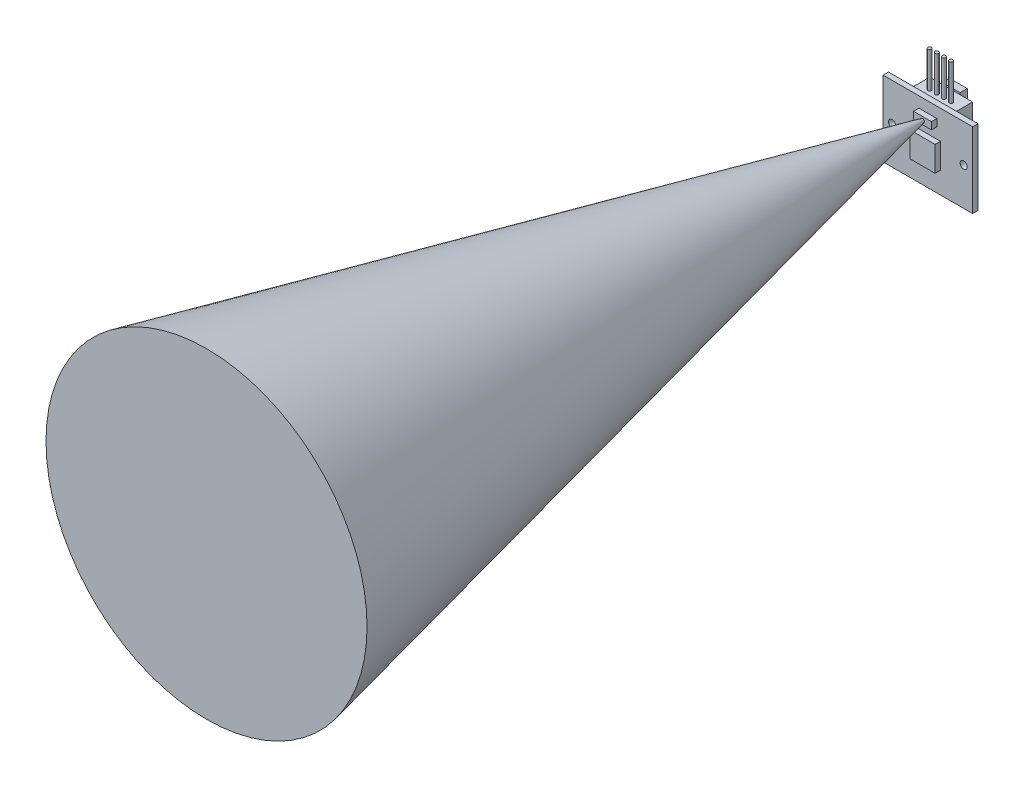
ISO-10303-21;
HEADER;
FILE_DESCRIPTION(('STEP AP214'),'2;1');
FILE_NAME('part.step','',(''),(''),'','','');
FILE_SCHEMA(('AUTOMOTIVE_DESIGN { 1 0 10303 214 1 1 1 1 }'));
ENDSEC;
DATA;
#1=APPLICATION_CONTEXT('core data for automotive mechanical design processes');
#2=APPLICATION_PROTOCOL_DEFINITION('international standard','automotive_design',2000,#1);
#3=PRODUCT_CONTEXT('',#1,'mechanical');
#4=PRODUCT('Part','Part','',(#3));
#5=PRODUCT_RELATED_PRODUCT_CATEGORY('part','',(#4));
#6=PRODUCT_DEFINITION_FORMATION('','',#4);
#7=PRODUCT_DEFINITION_CONTEXT('part definition',#1,'design');
#8=PRODUCT_DEFINITION('design','',#6,#7);
#9=PRODUCT_DEFINITION_SHAPE('','',#8);
#10=(LENGTH_UNIT() NAMED_UNIT(*) SI_UNIT(.MILLI.,.METRE.));
#11=(NAMED_UNIT(*) PLANE_ANGLE_UNIT() SI_UNIT($,.RADIAN.));
#12=(NAMED_UNIT(*) SI_UNIT($,.STERADIAN.) SOLID_ANGLE_UNIT());
#13=UNCERTAINTY_MEASURE_WITH_UNIT(LENGTH_MEASURE(1.E-05),#10,'distance_accuracy_value','');
#14=(GEOMETRIC_REPRESENTATION_CONTEXT(3) GLOBAL_UNCERTAINTY_ASSIGNED_CONTEXT((#13)) GLOBAL_UNIT_ASSIGNED_CONTEXT((#10,
#11,#12)) REPRESENTATION_CONTEXT('',''));
#15=CARTESIAN_POINT('',(0.,0.,0.));
#16=DIRECTION('',(0.,0.,1.));
#17=DIRECTION('',(1.,0.,0.));
#18=AXIS2_PLACEMENT_3D('',#15,#16,#17);
#19=CARTESIAN_POINT('',(0.,6.5,3.));
#20=DIRECTION('',(0.,0.,1.));
#21=DIRECTION('',(1.,0.,0.));
#22=AXIS2_PLACEMENT_3D('',#19,#20,#21);
#23=CONICAL_SURFACE('',#22,0.5,0.218166156499292);
#24=CARTESIAN_POINT('',(0.,6.5,203.));
#25=DIRECTION('',(0.,0.,1.));
#26=DIRECTION('',(1.,0.,0.));
#27=AXIS2_PLACEMENT_3D('',#24,#25,#26);
#28=CIRCLE('',#27,44.8389325285881);
#29=CARTESIAN_POINT('',(44.8389325285881,6.5,203.));
#30=VERTEX_POINT('',#29);
#31=EDGE_CURVE('E11',#30,#30,#28,.T.);
#32=CARTESIAN_POINT('',(0.,6.5,3.));
#33=DIRECTION('',(0.,0.,1.));
#34=DIRECTION('',(1.,0.,0.));
#35=AXIS2_PLACEMENT_3D('',#32,#33,#34);
#36=CIRCLE('',#35,0.5);
#37=CARTESIAN_POINT('',(0.5,6.5,3.));
#38=VERTEX_POINT('',#37);
#39=EDGE_CURVE('E50',#38,#38,#36,.T.);
#40=CARTESIAN_POINT('',(44.8389325285881,6.5,203.));
#41=CARTESIAN_POINT('',(44.377068648082,6.5,200.916666666667));
#42=CARTESIAN_POINT('',(43.9152047675758,6.5,198.833333333333));
#43=CARTESIAN_POINT('',(42.9914770065636,6.5,194.666666666667));
#44=CARTESIAN_POINT('',(42.5296131260575,6.5,192.583333333333));
#45=CARTESIAN_POINT('',(41.6058853650452,6.5,188.416666666667));
#46=CARTESIAN_POINT('',(41.1440214845391,6.5,186.333333333333));
#47=CARTESIAN_POINT('',(40.2202937235268,6.5,182.166666666667));
#48=CARTESIAN_POINT('',(39.7584298430207,6.5,180.083333333333));
#49=CARTESIAN_POINT('',(38.8347020820084,6.5,175.916666666667));
#50=CARTESIAN_POINT('',(38.3728382015023,6.5,173.833333333333));
#51=CARTESIAN_POINT('',(37.4491104404901,6.5,169.666666666667));
#52=CARTESIAN_POINT('',(36.9872465599839,6.5,167.583333333333));
#53=CARTESIAN_POINT('',(36.0635187989717,6.5,163.416666666667));
#54=CARTESIAN_POINT('',(35.6016549184656,6.5,161.333333333333));
#55=CARTESIAN_POINT('',(34.6779271574533,6.5,157.166666666667));
#56=CARTESIAN_POINT('',(34.2160632769472,6.5,155.083333333333));
#57=CARTESIAN_POINT('',(33.2923355159349,6.5,150.916666666667));
#58=CARTESIAN_POINT('',(32.8304716354288,6.5,148.833333333333));
#59=CARTESIAN_POINT('',(31.9067438744166,6.5,144.666666666667));
#60=CARTESIAN_POINT('',(31.4448799939104,6.5,142.583333333333));
#61=CARTESIAN_POINT('',(30.5211522328982,6.5,138.416666666667));
#62=CARTESIAN_POINT('',(30.0592883523921,6.5,136.333333333333));
#63=CARTESIAN_POINT('',(29.1355605913798,6.5,132.166666666667));
#64=CARTESIAN_POINT('',(28.6736967108737,6.5,130.083333333333));
#65=CARTESIAN_POINT('',(27.7499689498614,6.5,125.916666666667));
#66=CARTESIAN_POINT('',(27.2881050693553,6.5,123.833333333333));
#67=CARTESIAN_POINT('',(26.3643773083431,6.5,119.666666666667));
#68=CARTESIAN_POINT('',(25.9025134278369,6.5,117.583333333333));
#69=CARTESIAN_POINT('',(24.9787856668247,6.5,113.416666666667));
#70=CARTESIAN_POINT('',(24.5169217863185,6.5,111.333333333333));
#71=CARTESIAN_POINT('',(23.5931940253063,6.5,107.166666666667));
#72=CARTESIAN_POINT('',(23.1313301448002,6.5,105.083333333333));
#73=CARTESIAN_POINT('',(22.2076023837879,6.5,100.916666666667));
#74=CARTESIAN_POINT('',(21.7457385032818,6.5,98.8333333333333));
#75=CARTESIAN_POINT('',(20.8220107422695,6.5,94.6666666666667));
#76=CARTESIAN_POINT('',(20.3601468617634,6.5,92.5833333333333));
#77=CARTESIAN_POINT('',(19.4364191007512,6.5,88.4166666666667));
#78=CARTESIAN_POINT('',(18.974555220245,6.5,86.3333333333333));
#79=CARTESIAN_POINT('',(18.0508274592328,6.5,82.1666666666667));
#80=CARTESIAN_POINT('',(17.5889635787267,6.5,80.0833333333333));
#81=CARTESIAN_POINT('',(16.6652358177144,6.5,75.9166666666667));
#82=CARTESIAN_POINT('',(16.2033719372083,6.5,73.8333333333333));
#83=CARTESIAN_POINT('',(15.279644176196,6.5,69.6666666666667));
#84=CARTESIAN_POINT('',(14.8177802956899,6.5,67.5833333333333));
#85=CARTESIAN_POINT('',(13.8940525346777,6.5,63.4166666666667));
#86=CARTESIAN_POINT('',(13.4321886541715,6.5,61.3333333333333));
#87=CARTESIAN_POINT('',(12.5084608931593,6.5,57.1666666666667));
#88=CARTESIAN_POINT('',(12.0465970126531,6.5,55.0833333333333));
#89=CARTESIAN_POINT('',(11.1228692516409,6.5,50.9166666666667));
#90=CARTESIAN_POINT('',(10.6610053711348,6.5,48.8333333333333));
#91=CARTESIAN_POINT('',(9.73727761012252,6.5,44.6666666666667));
#92=CARTESIAN_POINT('',(9.27541372961639,6.5,42.5833333333333));
#93=CARTESIAN_POINT('',(8.35168596860414,6.5,38.4166666666667));
#94=CARTESIAN_POINT('',(7.88982208809801,6.5,36.3333333333333));
#95=CARTESIAN_POINT('',(6.96609432708576,6.5,32.1666666666667));
#96=CARTESIAN_POINT('',(6.50423044657964,6.5,30.0833333333333));
#97=CARTESIAN_POINT('',(5.58050268556738,6.5,25.9166666666667));
#98=CARTESIAN_POINT('',(5.11863880506126,6.5,23.8333333333333));
#99=CARTESIAN_POINT('',(4.19491104404901,6.5,19.6666666666667));
#100=CARTESIAN_POINT('',(3.73304716354288,6.5,17.5833333333333));
#101=CARTESIAN_POINT('',(2.80931940253063,6.5,13.4166666666667));
#102=CARTESIAN_POINT('',(2.34745552202451,6.5,11.3333333333333));
#103=CARTESIAN_POINT('',(1.42372776101225,6.5,7.16666666666667));
#104=CARTESIAN_POINT('',(0.961863880506126,6.5,5.08333333333334));
#105=CARTESIAN_POINT('',(0.5,6.5,3.));
#106=B_SPLINE_CURVE_WITH_KNOTS('',3,(#40,#41,#42,#43,#44,#45,#46,#47,#48,#49,#50,#51,#52,#53,
#54,#55,#56,#57,#58,#59,#60,#61,#62,#63,#64,#65,#66,#67,#68,#69,#70,#71,#72,#73,#74,#75,#76,#77,
#78,#79,#80,#81,#82,#83,#84,#85,#86,#87,#88,#89,#90,#91,#92,#93,#94,#95,#96,#97,#98,#99,#100,
#101,#102,#103,#104,#105),.UNSPECIFIED.,.F.,.F.,(4,2,2,2,2,2,2,2,2,2,2,2,2,2,2,2,2,2,2,2,2,2,2,
2,2,2,2,2,2,2,2,2,4),(0.,6.40174696446569,12.8034939289314,19.205240893397,25.6069878578627,
32.0087348223284,38.4104817867941,44.8122287512598,51.2139757157255,57.6157226801911,
64.0174696446568,70.4192166091225,76.8209635735882,83.2227105380539,89.6244575025196,
96.0262044669852,102.427951431451,108.829698395917,115.231445360382,121.633192324848,
128.034939289314,134.436686253779,140.838433218245,147.240180182711,153.641927147176,
160.043674111642,166.445421076108,172.847168040573,179.248915005039,185.650661969505,
192.05240893397,198.454155898436,204.855902862902),.UNSPECIFIED.);
#107=EDGE_CURVE('BSEAM44',#30,#38,#106,.T.);
#108=ORIENTED_EDGE('',*,*,#31,.F.);
#109=ORIENTED_EDGE('',*,*,#39,.T.);
#110=ORIENTED_EDGE('',*,*,#107,.T.);
#111=ORIENTED_EDGE('',*,*,#107,.F.);
#112=EDGE_LOOP('',(#108,#110,#109,#111));
#113=FACE_BOUND('',#112,.T.);
#114=ADVANCED_FACE('F44',(#113),#23,.T.);
#115=CARTESIAN_POINT('',(0.,6.5,203.));
#116=DIRECTION('',(0.,0.,1.));
#117=DIRECTION('',(1.,0.,0.));
#118=AXIS2_PLACEMENT_3D('',#115,#116,#117);
#119=PLANE('',#118);
#120=ORIENTED_EDGE('',*,*,#31,.T.);
#121=EDGE_LOOP('',(#120));
#122=FACE_BOUND('',#121,.T.);
#123=ADVANCED_FACE('F59',(#122),#119,.T.);
#124=CARTESIAN_POINT('',(0.,6.5,3.));
#125=DIRECTION('',(0.,0.,1.));
#126=DIRECTION('',(1.,0.,0.));
#127=AXIS2_PLACEMENT_3D('',#124,#125,#126);
#128=PLANE('',#127);
#129=ORIENTED_EDGE('',*,*,#39,.F.);
#130=EDGE_LOOP('',(#129));
#131=FACE_BOUND('',#130,.T.);
#132=ADVANCED_FACE('F57',(#131),#128,.F.);
#133=CLOSED_SHELL('',(#114,#123,#132));
#134=MANIFOLD_SOLID_BREP('B2_NOT_SHOWN',#133);
#135=CARTESIAN_POINT('',(3.,20.,-2.));
#136=DIRECTION('',(0.,-1.,0.));
#137=DIRECTION('',(1.,0.,0.));
#138=AXIS2_PLACEMENT_3D('',#135,#136,#137);
#139=CYLINDRICAL_SURFACE('',#138,0.5);
#140=CARTESIAN_POINT('',(3.,20.,-2.));
#141=DIRECTION('',(0.,1.,0.));
#142=DIRECTION('',(-1.,0.,0.));
#143=AXIS2_PLACEMENT_3D('',#140,#141,#142);
#144=CIRCLE('',#143,0.5);
#145=CARTESIAN_POINT('',(2.5,20.,-2.));
#146=VERTEX_POINT('',#145);
#147=EDGE_CURVE('E43',#146,#146,#144,.T.);
#148=ORIENTED_EDGE('',*,*,#147,.F.);
#149=EDGE_LOOP('',(#148));
#150=FACE_BOUND('',#149,.T.);
#151=CARTESIAN_POINT('',(3.,10.,-2.));
#152=DIRECTION('',(0.,1.,0.));
#153=DIRECTION('',(-1.,0.,0.));
#154=AXIS2_PLACEMENT_3D('',#151,#152,#153);
#155=CIRCLE('',#154,0.5);
#156=CARTESIAN_POINT('',(2.5,10.,-2.));
#157=VERTEX_POINT('',#156);
#158=EDGE_CURVE('E95',#157,#157,#155,.T.);
#159=ORIENTED_EDGE('',*,*,#158,.T.);
#160=EDGE_LOOP('',(#159));
#161=FACE_BOUND('',#160,.T.);
#162=ADVANCED_FACE('F92',(#150,#161),#139,.T.);
#163=CARTESIAN_POINT('',(3.,20.,-2.));
#164=DIRECTION('',(0.,1.,0.));
#165=DIRECTION('',(-1.,0.,0.));
#166=AXIS2_PLACEMENT_3D('',#163,#164,#165);
#167=PLANE('',#166);
#168=ORIENTED_EDGE('',*,*,#147,.T.);
#169=EDGE_LOOP('',(#168));
#170=FACE_BOUND('',#169,.T.);
#171=ADVANCED_FACE('F107',(#170),#167,.T.);
#172=CARTESIAN_POINT('',(3.,10.,-2.));
#173=DIRECTION('',(0.,1.,0.));
#174=DIRECTION('',(-1.,0.,0.));
#175=AXIS2_PLACEMENT_3D('',#172,#173,#174);
#176=PLANE('',#175);
#177=ORIENTED_EDGE('',*,*,#158,.F.);
#178=EDGE_LOOP('',(#177));
#179=FACE_BOUND('',#178,.T.);
#180=ADVANCED_FACE('F105',(#179),#176,.F.);
#181=CLOSED_SHELL('',(#162,#171,#180));
#182=MANIFOLD_SOLID_BREP('B6',#181);
#183=CARTESIAN_POINT('',(1.,20.,-2.));
#184=DIRECTION('',(0.,-1.,0.));
#185=DIRECTION('',(1.,0.,0.));
#186=AXIS2_PLACEMENT_3D('',#183,#184,#185);
#187=CYLINDRICAL_SURFACE('',#186,0.5);
#188=CARTESIAN_POINT('',(1.,20.,-2.));
#189=DIRECTION('',(0.,1.,0.));
#190=DIRECTION('',(-1.,0.,0.));
#191=AXIS2_PLACEMENT_3D('',#188,#189,#190);
#192=CIRCLE('',#191,0.5);
#193=CARTESIAN_POINT('',(0.500000000000003,20.,-2.));
#194=VERTEX_POINT('',#193);
#195=EDGE_CURVE('E91',#194,#194,#192,.T.);
#196=ORIENTED_EDGE('',*,*,#195,.F.);
#197=EDGE_LOOP('',(#196));
#198=FACE_BOUND('',#197,.T.);
#199=CARTESIAN_POINT('',(1.,10.,-2.));
#200=DIRECTION('',(0.,1.,0.));
#201=DIRECTION('',(-1.,0.,0.));
#202=AXIS2_PLACEMENT_3D('',#199,#200,#201);
#203=CIRCLE('',#202,0.5);
#204=CARTESIAN_POINT('',(0.500000000000001,10.,-2.));
#205=VERTEX_POINT('',#204);
#206=EDGE_CURVE('E143',#205,#205,#203,.T.);
#207=ORIENTED_EDGE('',*,*,#206,.T.);
#208=EDGE_LOOP('',(#207));
#209=FACE_BOUND('',#208,.T.);
#210=ADVANCED_FACE('F140',(#198,#209),#187,.T.);
#211=CARTESIAN_POINT('',(1.,20.,-2.));
#212=DIRECTION('',(0.,1.,0.));
#213=DIRECTION('',(-1.,0.,0.));
#214=AXIS2_PLACEMENT_3D('',#211,#212,#213);
#215=PLANE('',#214);
#216=ORIENTED_EDGE('',*,*,#195,.T.);
#217=EDGE_LOOP('',(#216));
#218=FACE_BOUND('',#217,.T.);
#219=ADVANCED_FACE('F155',(#218),#215,.T.);
#220=CARTESIAN_POINT('',(1.,10.,-2.));
#221=DIRECTION('',(0.,1.,0.));
#222=DIRECTION('',(-1.,0.,0.));
#223=AXIS2_PLACEMENT_3D('',#220,#221,#222);
#224=PLANE('',#223);
#225=ORIENTED_EDGE('',*,*,#206,.F.);
#226=EDGE_LOOP('',(#225));
#227=FACE_BOUND('',#226,.T.);
#228=ADVANCED_FACE('F153',(#227),#224,.F.);
#229=CLOSED_SHELL('',(#210,#219,#228));
#230=MANIFOLD_SOLID_BREP('B38',#229);
#231=CARTESIAN_POINT('',(-0.999999999999997,20.,-2.));
#232=DIRECTION('',(0.,-1.,0.));
#233=DIRECTION('',(1.,0.,0.));
#234=AXIS2_PLACEMENT_3D('',#231,#232,#233);
#235=CYLINDRICAL_SURFACE('',#234,0.5);
#236=CARTESIAN_POINT('',(-0.999999999999997,20.,-2.));
#237=DIRECTION('',(0.,1.,0.));
#238=DIRECTION('',(-1.,0.,0.));
#239=AXIS2_PLACEMENT_3D('',#236,#237,#238);
#240=CIRCLE('',#239,0.5);
#241=CARTESIAN_POINT('',(-1.5,20.,-2.));
#242=VERTEX_POINT('',#241);
#243=EDGE_CURVE('E139',#242,#242,#240,.T.);
#244=ORIENTED_EDGE('',*,*,#243,.F.);
#245=EDGE_LOOP('',(#244));
#246=FACE_BOUND('',#245,.T.);
#247=CARTESIAN_POINT('',(-0.999999999999999,10.,-2.));
#248=DIRECTION('',(0.,1.,0.));
#249=DIRECTION('',(-1.,0.,0.));
#250=AXIS2_PLACEMENT_3D('',#247,#248,#249);
#251=CIRCLE('',#250,0.5);
#252=CARTESIAN_POINT('',(-1.5,10.,-2.));
#253=VERTEX_POINT('',#252);
#254=EDGE_CURVE('E191',#253,#253,#251,.T.);
#255=ORIENTED_EDGE('',*,*,#254,.T.);
#256=EDGE_LOOP('',(#255));
#257=FACE_BOUND('',#256,.T.);
#258=ADVANCED_FACE('F188',(#246,#257),#235,.T.);
#259=CARTESIAN_POINT('',(-0.999999999999997,20.,-2.));
#260=DIRECTION('',(0.,1.,0.));
#261=DIRECTION('',(-1.,0.,0.));
#262=AXIS2_PLACEMENT_3D('',#259,#260,#261);
#263=PLANE('',#262);
#264=ORIENTED_EDGE('',*,*,#243,.T.);
#265=EDGE_LOOP('',(#264));
#266=FACE_BOUND('',#265,.T.);
#267=ADVANCED_FACE('F203',(#266),#263,.T.);
#268=CARTESIAN_POINT('',(-0.999999999999999,10.,-2.));
#269=DIRECTION('',(0.,1.,0.));
#270=DIRECTION('',(-1.,0.,0.));
#271=AXIS2_PLACEMENT_3D('',#268,#269,#270);
#272=PLANE('',#271);
#273=ORIENTED_EDGE('',*,*,#254,.F.);
#274=EDGE_LOOP('',(#273));
#275=FACE_BOUND('',#274,.T.);
#276=ADVANCED_FACE('F201',(#275),#272,.F.);
#277=CLOSED_SHELL('',(#258,#267,#276));
#278=MANIFOLD_SOLID_BREP('B86',#277);
#279=CARTESIAN_POINT('',(-3.,20.,-2.));
#280=DIRECTION('',(0.,-1.,0.));
#281=DIRECTION('',(1.,0.,0.));
#282=AXIS2_PLACEMENT_3D('',#279,#280,#281);
#283=CYLINDRICAL_SURFACE('',#282,0.5);
#284=CARTESIAN_POINT('',(-3.,20.,-2.));
#285=DIRECTION('',(0.,1.,0.));
#286=DIRECTION('',(-1.,0.,0.));
#287=AXIS2_PLACEMENT_3D('',#284,#285,#286);
#288=CIRCLE('',#287,0.5);
#289=CARTESIAN_POINT('',(-3.5,20.,-2.));
#290=VERTEX_POINT('',#289);
#291=EDGE_CURVE('E187',#290,#290,#288,.T.);
#292=ORIENTED_EDGE('',*,*,#291,.F.);
#293=EDGE_LOOP('',(#292));
#294=FACE_BOUND('',#293,.T.);
#295=CARTESIAN_POINT('',(-3.,10.,-2.));
#296=DIRECTION('',(0.,1.,0.));
#297=DIRECTION('',(-1.,0.,0.));
#298=AXIS2_PLACEMENT_3D('',#295,#296,#297);
#299=CIRCLE('',#298,0.5);
#300=CARTESIAN_POINT('',(-3.5,10.,-2.));
#301=VERTEX_POINT('',#300);
#302=EDGE_CURVE('E241',#301,#301,#299,.T.);
#303=ORIENTED_EDGE('',*,*,#302,.T.);
#304=EDGE_LOOP('',(#303));
#305=FACE_BOUND('',#304,.T.);
#306=ADVANCED_FACE('F238',(#294,#305),#283,.T.);
#307=CARTESIAN_POINT('',(-3.,20.,-2.));
#308=DIRECTION('',(0.,1.,0.));
#309=DIRECTION('',(-1.,0.,0.));
#310=AXIS2_PLACEMENT_3D('',#307,#308,#309);
#311=PLANE('',#310);
#312=ORIENTED_EDGE('',*,*,#291,.T.);
#313=EDGE_LOOP('',(#312));
#314=FACE_BOUND('',#313,.T.);
#315=ADVANCED_FACE('F253',(#314),#311,.T.);
#316=CARTESIAN_POINT('',(-3.,10.,-2.));
#317=DIRECTION('',(0.,1.,0.));
#318=DIRECTION('',(-1.,0.,0.));
#319=AXIS2_PLACEMENT_3D('',#316,#317,#318);
#320=PLANE('',#319);
#321=ORIENTED_EDGE('',*,*,#302,.F.);
#322=EDGE_LOOP('',(#321));
#323=FACE_BOUND('',#322,.T.);
#324=ADVANCED_FACE('F251',(#323),#320,.F.);
#325=CLOSED_SHELL('',(#306,#315,#324));
#326=MANIFOLD_SOLID_BREP('B134',#325);
#327=CARTESIAN_POINT('',(-3.5,2.5,3.));
#328=DIRECTION('',(1.,0.,0.));
#329=DIRECTION('',(0.,1.,0.));
#330=AXIS2_PLACEMENT_3D('',#327,#328,#329);
#331=PLANE('',#330);
#332=DIRECTION('',(0.,-1.,0.));
#333=VECTOR('',#332,1.);
#334=CARTESIAN_POINT('',(-3.5,2.5,1.5));
#335=LINE('',#334,#333);
#336=CARTESIAN_POINT('',(-3.5,2.5,1.5));
#337=VERTEX_POINT('',#336);
#338=CARTESIAN_POINT('',(-3.5,-4.5,1.5));
#339=VERTEX_POINT('',#338);
#340=EDGE_CURVE('E351',#337,#339,#335,.T.);
#341=ORIENTED_EDGE('',*,*,#340,.T.);
#342=DIRECTION('',(0.,0.,-1.));
#343=VECTOR('',#342,1.);
#344=CARTESIAN_POINT('',(-3.5,-4.5,3.));
#345=LINE('',#344,#343);
#346=CARTESIAN_POINT('',(-3.5,-4.5,3.));
#347=VERTEX_POINT('',#346);
#348=EDGE_CURVE('E236',#347,#339,#345,.T.);
#349=ORIENTED_EDGE('',*,*,#348,.F.);
#350=DIRECTION('',(0.,-1.,0.));
#351=VECTOR('',#350,1.);
#352=CARTESIAN_POINT('',(-3.5,2.5,3.));
#353=LINE('',#352,#351);
#354=CARTESIAN_POINT('',(-3.5,2.5,3.));
#355=VERTEX_POINT('',#354);
#356=EDGE_CURVE('E339',#355,#347,#353,.T.);
#357=ORIENTED_EDGE('',*,*,#356,.F.);
#358=DIRECTION('',(0.,0.,-1.));
#359=VECTOR('',#358,1.);
#360=CARTESIAN_POINT('',(-3.5,2.5,3.));
#361=LINE('',#360,#359);
#362=EDGE_CURVE('E347',#355,#337,#361,.T.);
#363=ORIENTED_EDGE('',*,*,#362,.T.);
#364=EDGE_LOOP('',(#341,#349,#357,#363));
#365=FACE_BOUND('',#364,.T.);
#366=ADVANCED_FACE('F288',(#365),#331,.F.);
#367=CARTESIAN_POINT('',(-3.5,-4.5,3.));
#368=DIRECTION('',(0.,1.,0.));
#369=DIRECTION('',(0.,0.,1.));
#370=AXIS2_PLACEMENT_3D('',#367,#368,#369);
#371=PLANE('',#370);
#372=DIRECTION('',(1.,0.,0.));
#373=VECTOR('',#372,1.);
#374=CARTESIAN_POINT('',(-3.5,-4.5,1.5));
#375=LINE('',#374,#373);
#376=CARTESIAN_POINT('',(3.5,-4.5,1.5));
#377=VERTEX_POINT('',#376);
#378=EDGE_CURVE('E343',#339,#377,#375,.T.);
#379=ORIENTED_EDGE('',*,*,#378,.T.);
#380=DIRECTION('',(0.,0.,-1.));
#381=VECTOR('',#380,1.);
#382=CARTESIAN_POINT('',(3.5,-4.5,3.));
#383=LINE('',#382,#381);
#384=CARTESIAN_POINT('',(3.5,-4.5,3.));
#385=VERTEX_POINT('',#384);
#386=EDGE_CURVE('E296',#385,#377,#383,.T.);
#387=ORIENTED_EDGE('',*,*,#386,.F.);
#388=DIRECTION('',(1.,0.,0.));
#389=VECTOR('',#388,1.);
#390=CARTESIAN_POINT('',(-3.5,-4.5,3.));
#391=LINE('',#390,#389);
#392=EDGE_CURVE('E334',#347,#385,#391,.T.);
#393=ORIENTED_EDGE('',*,*,#392,.F.);
#394=ORIENTED_EDGE('',*,*,#348,.T.);
#395=EDGE_LOOP('',(#379,#387,#393,#394));
#396=FACE_BOUND('',#395,.T.);
#397=ADVANCED_FACE('F342',(#396),#371,.F.);
#398=CARTESIAN_POINT('',(3.5,2.5,3.));
#399=DIRECTION('',(-1.,0.,0.));
#400=DIRECTION('',(0.,-1.,0.));
#401=AXIS2_PLACEMENT_3D('',#398,#399,#400);
#402=PLANE('',#401);
#403=DIRECTION('',(0.,1.,0.));
#404=VECTOR('',#403,1.);
#405=CARTESIAN_POINT('',(3.5,2.5,1.5));
#406=LINE('',#405,#404);
#407=CARTESIAN_POINT('',(3.5,2.5,1.5));
#408=VERTEX_POINT('',#407);
#409=EDGE_CURVE('E321',#377,#408,#406,.T.);
#410=ORIENTED_EDGE('',*,*,#409,.T.);
#411=DIRECTION('',(0.,0.,-1.));
#412=VECTOR('',#411,1.);
#413=CARTESIAN_POINT('',(3.5,2.5,3.));
#414=LINE('',#413,#412);
#415=CARTESIAN_POINT('',(3.5,2.5,3.));
#416=VERTEX_POINT('',#415);
#417=EDGE_CURVE('E344',#416,#408,#414,.T.);
#418=ORIENTED_EDGE('',*,*,#417,.F.);
#419=DIRECTION('',(0.,1.,0.));
#420=VECTOR('',#419,1.);
#421=CARTESIAN_POINT('',(3.5,2.5,3.));
#422=LINE('',#421,#420);
#423=EDGE_CURVE('E337',#385,#416,#422,.T.);
#424=ORIENTED_EDGE('',*,*,#423,.F.);
#425=ORIENTED_EDGE('',*,*,#386,.T.);
#426=EDGE_LOOP('',(#410,#418,#424,#425));
#427=FACE_BOUND('',#426,.T.);
#428=ADVANCED_FACE('F345',(#427),#402,.F.);
#429=CARTESIAN_POINT('',(-3.5,2.5,3.));
#430=DIRECTION('',(0.,-1.,0.));
#431=DIRECTION('',(0.,0.,-1.));
#432=AXIS2_PLACEMENT_3D('',#429,#430,#431);
#433=PLANE('',#432);
#434=DIRECTION('',(-1.,0.,0.));
#435=VECTOR('',#434,1.);
#436=CARTESIAN_POINT('',(-3.5,2.5,1.5));
#437=LINE('',#436,#435);
#438=EDGE_CURVE('E327',#408,#337,#437,.T.);
#439=ORIENTED_EDGE('',*,*,#438,.T.);
#440=ORIENTED_EDGE('',*,*,#362,.F.);
#441=DIRECTION('',(-1.,0.,0.));
#442=VECTOR('',#441,1.);
#443=CARTESIAN_POINT('',(-3.5,2.5,3.));
#444=LINE('',#443,#442);
#445=EDGE_CURVE('E304',#416,#355,#444,.T.);
#446=ORIENTED_EDGE('',*,*,#445,.F.);
#447=ORIENTED_EDGE('',*,*,#417,.T.);
#448=EDGE_LOOP('',(#439,#440,#446,#447));
#449=FACE_BOUND('',#448,.T.);
#450=ADVANCED_FACE('F358',(#449),#433,.F.);
#451=CARTESIAN_POINT('',(0.,0.,3.));
#452=DIRECTION('',(0.,0.,1.));
#453=DIRECTION('',(1.,0.,0.));
#454=AXIS2_PLACEMENT_3D('',#451,#452,#453);
#455=PLANE('',#454);
#456=ORIENTED_EDGE('',*,*,#356,.T.);
#457=ORIENTED_EDGE('',*,*,#392,.T.);
#458=ORIENTED_EDGE('',*,*,#423,.T.);
#459=ORIENTED_EDGE('',*,*,#445,.T.);
#460=EDGE_LOOP('',(#456,#457,#458,#459));
#461=FACE_BOUND('',#460,.T.);
#462=ADVANCED_FACE('F335',(#461),#455,.T.);
#463=CARTESIAN_POINT('',(0.,0.,1.5));
#464=DIRECTION('',(0.,0.,1.));
#465=DIRECTION('',(1.,0.,0.));
#466=AXIS2_PLACEMENT_3D('',#463,#464,#465);
#467=PLANE('',#466);
#468=ORIENTED_EDGE('',*,*,#340,.F.);
#469=ORIENTED_EDGE('',*,*,#438,.F.);
#470=ORIENTED_EDGE('',*,*,#409,.F.);
#471=ORIENTED_EDGE('',*,*,#378,.F.);
#472=EDGE_LOOP('',(#468,#469,#470,#471));
#473=FACE_BOUND('',#472,.T.);
#474=ADVANCED_FACE('F361',(#473),#467,.F.);
#475=CLOSED_SHELL('',(#366,#397,#428,#450,#462,#474));
#476=MANIFOLD_SOLID_BREP('B182',#475);
#477=CARTESIAN_POINT('',(-2.5,7.5,3.));
#478=DIRECTION('',(1.,0.,0.));
#479=DIRECTION('',(0.,1.,0.));
#480=AXIS2_PLACEMENT_3D('',#477,#478,#479);
#481=PLANE('',#480);
#482=DIRECTION('',(0.,-1.,0.));
#483=VECTOR('',#482,1.);
#484=CARTESIAN_POINT('',(-2.5,7.5,1.5));
#485=LINE('',#484,#483);
#486=CARTESIAN_POINT('',(-2.5,7.5,1.5));
#487=VERTEX_POINT('',#486);
#488=CARTESIAN_POINT('',(-2.5,5.5,1.5));
#489=VERTEX_POINT('',#488);
#490=EDGE_CURVE('E484',#487,#489,#485,.T.);
#491=ORIENTED_EDGE('',*,*,#490,.T.);
#492=DIRECTION('',(0.,0.,-1.));
#493=VECTOR('',#492,1.);
#494=CARTESIAN_POINT('',(-2.5,5.5,3.));
#495=LINE('',#494,#493);
#496=CARTESIAN_POINT('',(-2.5,5.5,3.));
#497=VERTEX_POINT('',#496);
#498=EDGE_CURVE('E286',#497,#489,#495,.T.);
#499=ORIENTED_EDGE('',*,*,#498,.F.);
#500=DIRECTION('',(0.,-1.,0.));
#501=VECTOR('',#500,1.);
#502=CARTESIAN_POINT('',(-2.5,7.5,3.));
#503=LINE('',#502,#501);
#504=CARTESIAN_POINT('',(-2.5,7.5,3.));
#505=VERTEX_POINT('',#504);
#506=EDGE_CURVE('E472',#505,#497,#503,.T.);
#507=ORIENTED_EDGE('',*,*,#506,.F.);
#508=DIRECTION('',(0.,0.,-1.));
#509=VECTOR('',#508,1.);
#510=CARTESIAN_POINT('',(-2.5,7.5,3.));
#511=LINE('',#510,#509);
#512=EDGE_CURVE('E480',#505,#487,#511,.T.);
#513=ORIENTED_EDGE('',*,*,#512,.T.);
#514=EDGE_LOOP('',(#491,#499,#507,#513));
#515=FACE_BOUND('',#514,.T.);
#516=ADVANCED_FACE('F421',(#515),#481,.F.);
#517=CARTESIAN_POINT('',(-2.5,5.5,3.));
#518=DIRECTION('',(0.,1.,0.));
#519=DIRECTION('',(0.,0.,1.));
#520=AXIS2_PLACEMENT_3D('',#517,#518,#519);
#521=PLANE('',#520);
#522=DIRECTION('',(1.,0.,0.));
#523=VECTOR('',#522,1.);
#524=CARTESIAN_POINT('',(-2.5,5.5,1.5));
#525=LINE('',#524,#523);
#526=CARTESIAN_POINT('',(2.5,5.5,1.5));
#527=VERTEX_POINT('',#526);
#528=EDGE_CURVE('E476',#489,#527,#525,.T.);
#529=ORIENTED_EDGE('',*,*,#528,.T.);
#530=DIRECTION('',(0.,0.,-1.));
#531=VECTOR('',#530,1.);
#532=CARTESIAN_POINT('',(2.5,5.5,3.));
#533=LINE('',#532,#531);
#534=CARTESIAN_POINT('',(2.5,5.5,3.));
#535=VERTEX_POINT('',#534);
#536=EDGE_CURVE('E429',#535,#527,#533,.T.);
#537=ORIENTED_EDGE('',*,*,#536,.F.);
#538=DIRECTION('',(1.,0.,0.));
#539=VECTOR('',#538,1.);
#540=CARTESIAN_POINT('',(-2.5,5.5,3.));
#541=LINE('',#540,#539);
#542=EDGE_CURVE('E467',#497,#535,#541,.T.);
#543=ORIENTED_EDGE('',*,*,#542,.F.);
#544=ORIENTED_EDGE('',*,*,#498,.T.);
#545=EDGE_LOOP('',(#529,#537,#543,#544));
#546=FACE_BOUND('',#545,.T.);
#547=ADVANCED_FACE('F475',(#546),#521,.F.);
#548=CARTESIAN_POINT('',(2.5,7.5,3.));
#549=DIRECTION('',(-1.,0.,0.));
#550=DIRECTION('',(0.,-1.,0.));
#551=AXIS2_PLACEMENT_3D('',#548,#549,#550);
#552=PLANE('',#551);
#553=DIRECTION('',(0.,1.,0.));
#554=VECTOR('',#553,1.);
#555=CARTESIAN_POINT('',(2.5,7.5,1.5));
#556=LINE('',#555,#554);
#557=CARTESIAN_POINT('',(2.5,7.5,1.5));
#558=VERTEX_POINT('',#557);
#559=EDGE_CURVE('E454',#527,#558,#556,.T.);
#560=ORIENTED_EDGE('',*,*,#559,.T.);
#561=DIRECTION('',(0.,0.,-1.));
#562=VECTOR('',#561,1.);
#563=CARTESIAN_POINT('',(2.5,7.5,3.));
#564=LINE('',#563,#562);
#565=CARTESIAN_POINT('',(2.5,7.5,3.));
#566=VERTEX_POINT('',#565);
#567=EDGE_CURVE('E477',#566,#558,#564,.T.);
#568=ORIENTED_EDGE('',*,*,#567,.F.);
#569=DIRECTION('',(0.,1.,0.));
#570=VECTOR('',#569,1.);
#571=CARTESIAN_POINT('',(2.5,7.5,3.));
#572=LINE('',#571,#570);
#573=EDGE_CURVE('E470',#535,#566,#572,.T.);
#574=ORIENTED_EDGE('',*,*,#573,.F.);
#575=ORIENTED_EDGE('',*,*,#536,.T.);
#576=EDGE_LOOP('',(#560,#568,#574,#575));
#577=FACE_BOUND('',#576,.T.);
#578=ADVANCED_FACE('F478',(#577),#552,.F.);
#579=CARTESIAN_POINT('',(-2.5,7.5,3.));
#580=DIRECTION('',(0.,-1.,0.));
#581=DIRECTION('',(0.,0.,-1.));
#582=AXIS2_PLACEMENT_3D('',#579,#580,#581);
#583=PLANE('',#582);
#584=DIRECTION('',(-1.,0.,0.));
#585=VECTOR('',#584,1.);
#586=CARTESIAN_POINT('',(-2.5,7.5,1.5));
#587=LINE('',#586,#585);
#588=EDGE_CURVE('E460',#558,#487,#587,.T.);
#589=ORIENTED_EDGE('',*,*,#588,.T.);
#590=ORIENTED_EDGE('',*,*,#512,.F.);
#591=DIRECTION('',(-1.,0.,0.));
#592=VECTOR('',#591,1.);
#593=CARTESIAN_POINT('',(-2.5,7.5,3.));
#594=LINE('',#593,#592);
#595=EDGE_CURVE('E437',#566,#505,#594,.T.);
#596=ORIENTED_EDGE('',*,*,#595,.F.);
#597=ORIENTED_EDGE('',*,*,#567,.T.);
#598=EDGE_LOOP('',(#589,#590,#596,#597));
#599=FACE_BOUND('',#598,.T.);
#600=ADVANCED_FACE('F491',(#599),#583,.F.);
#601=CARTESIAN_POINT('',(0.,0.,3.));
#602=DIRECTION('',(0.,0.,1.));
#603=DIRECTION('',(1.,0.,0.));
#604=AXIS2_PLACEMENT_3D('',#601,#602,#603);
#605=PLANE('',#604);
#606=ORIENTED_EDGE('',*,*,#506,.T.);
#607=ORIENTED_EDGE('',*,*,#542,.T.);
#608=ORIENTED_EDGE('',*,*,#573,.T.);
#609=ORIENTED_EDGE('',*,*,#595,.T.);
#610=EDGE_LOOP('',(#606,#607,#608,#609));
#611=FACE_BOUND('',#610,.T.);
#612=ADVANCED_FACE('F468',(#611),#605,.T.);
#613=CARTESIAN_POINT('',(0.,0.,1.5));
#614=DIRECTION('',(0.,0.,1.));
#615=DIRECTION('',(1.,0.,0.));
#616=AXIS2_PLACEMENT_3D('',#613,#614,#615);
#617=PLANE('',#616);
#618=ORIENTED_EDGE('',*,*,#490,.F.);
#619=ORIENTED_EDGE('',*,*,#588,.F.);
#620=ORIENTED_EDGE('',*,*,#559,.F.);
#621=ORIENTED_EDGE('',*,*,#528,.F.);
#622=EDGE_LOOP('',(#618,#619,#620,#621));
#623=FACE_BOUND('',#622,.T.);
#624=ADVANCED_FACE('F494',(#623),#617,.F.);
#625=CLOSED_SHELL('',(#516,#547,#578,#600,#612,#624));
#626=MANIFOLD_SOLID_BREP('B230',#625);
#627=CARTESIAN_POINT('',(6.,10.,-5.));
#628=DIRECTION('',(-1.,0.,0.));
#629=DIRECTION('',(0.,0.,1.));
#630=AXIS2_PLACEMENT_3D('',#627,#628,#629);
#631=PLANE('',#630);
#632=DIRECTION('',(0.,-1.,0.));
#633=VECTOR('',#632,1.);
#634=CARTESIAN_POINT('',(6.,10.,0.));
#635=LINE('',#634,#633);
#636=CARTESIAN_POINT('',(6.,10.,0.));
#637=VERTEX_POINT('',#636);
#638=CARTESIAN_POINT('',(6.,0.,0.));
#639=VERTEX_POINT('',#638);
#640=EDGE_CURVE('E644',#637,#639,#635,.T.);
#641=ORIENTED_EDGE('',*,*,#640,.T.);
#642=DIRECTION('',(0.,0.,1.));
#643=VECTOR('',#642,1.);
#644=CARTESIAN_POINT('',(6.,0.,-5.));
#645=LINE('',#644,#643);
#646=CARTESIAN_POINT('',(6.,0.,-5.));
#647=VERTEX_POINT('',#646);
#648=EDGE_CURVE('E556',#647,#639,#645,.T.);
#649=ORIENTED_EDGE('',*,*,#648,.F.);
#650=DIRECTION('',(0.,-1.,0.));
#651=VECTOR('',#650,1.);
#652=CARTESIAN_POINT('',(6.,10.,-5.));
#653=LINE('',#652,#651);
#654=CARTESIAN_POINT('',(6.,10.,-5.));
#655=VERTEX_POINT('',#654);
#656=EDGE_CURVE('E653',#655,#647,#653,.T.);
#657=ORIENTED_EDGE('',*,*,#656,.F.);
#658=DIRECTION('',(0.,0.,1.));
#659=VECTOR('',#658,1.);
#660=CARTESIAN_POINT('',(6.,10.,-5.));
#661=LINE('',#660,#659);
#662=EDGE_CURVE('E664',#655,#637,#661,.T.);
#663=ORIENTED_EDGE('',*,*,#662,.T.);
#664=EDGE_LOOP('',(#641,#649,#657,#663));
#665=FACE_BOUND('',#664,.T.);
#666=ADVANCED_FACE('F553',(#665),#631,.F.);
#667=CARTESIAN_POINT('',(6.,0.,-5.));
#668=DIRECTION('',(0.,1.,0.));
#669=DIRECTION('',(0.,0.,1.));
#670=AXIS2_PLACEMENT_3D('',#667,#668,#669);
#671=PLANE('',#670);
#672=DIRECTION('',(-1.,0.,0.));
#673=VECTOR('',#672,1.);
#674=CARTESIAN_POINT('',(6.,0.,0.));
#675=LINE('',#674,#673);
#676=CARTESIAN_POINT('',(-6.,0.,0.));
#677=VERTEX_POINT('',#676);
#678=EDGE_CURVE('E647',#639,#677,#675,.T.);
#679=ORIENTED_EDGE('',*,*,#678,.T.);
#680=DIRECTION('',(0.,0.,1.));
#681=VECTOR('',#680,1.);
#682=CARTESIAN_POINT('',(-6.,0.,-5.));
#683=LINE('',#682,#681);
#684=CARTESIAN_POINT('',(-6.,0.,-5.));
#685=VERTEX_POINT('',#684);
#686=EDGE_CURVE('E675',#685,#677,#683,.T.);
#687=ORIENTED_EDGE('',*,*,#686,.F.);
#688=DIRECTION('',(-1.,0.,0.));
#689=VECTOR('',#688,1.);
#690=CARTESIAN_POINT('',(6.,0.,-5.));
#691=LINE('',#690,#689);
#692=EDGE_CURVE('E656',#647,#685,#691,.T.);
#693=ORIENTED_EDGE('',*,*,#692,.F.);
#694=ORIENTED_EDGE('',*,*,#648,.T.);
#695=EDGE_LOOP('',(#679,#687,#693,#694));
#696=FACE_BOUND('',#695,.T.);
#697=ADVANCED_FACE('F684',(#696),#671,.F.);
#698=CARTESIAN_POINT('',(-6.,10.,-5.));
#699=DIRECTION('',(1.,0.,0.));
#700=DIRECTION('',(0.,1.,0.));
#701=AXIS2_PLACEMENT_3D('',#698,#699,#700);
#702=PLANE('',#701);
#703=DIRECTION('',(0.,1.,0.));
#704=VECTOR('',#703,1.);
#705=CARTESIAN_POINT('',(-6.,10.,0.));
#706=LINE('',#705,#704);
#707=CARTESIAN_POINT('',(-6.,10.,0.));
#708=VERTEX_POINT('',#707);
#709=EDGE_CURVE('E668',#677,#708,#706,.T.);
#710=ORIENTED_EDGE('',*,*,#709,.T.);
#711=DIRECTION('',(0.,0.,1.));
#712=VECTOR('',#711,1.);
#713=CARTESIAN_POINT('',(-6.,10.,-5.));
#714=LINE('',#713,#712);
#715=CARTESIAN_POINT('',(-6.,10.,-5.));
#716=VERTEX_POINT('',#715);
#717=EDGE_CURVE('E673',#716,#708,#714,.T.);
#718=ORIENTED_EDGE('',*,*,#717,.F.);
#719=DIRECTION('',(0.,1.,0.));
#720=VECTOR('',#719,1.);
#721=CARTESIAN_POINT('',(-6.,10.,-5.));
#722=LINE('',#721,#720);
#723=EDGE_CURVE('E659',#685,#716,#722,.T.);
#724=ORIENTED_EDGE('',*,*,#723,.F.);
#725=ORIENTED_EDGE('',*,*,#686,.T.);
#726=EDGE_LOOP('',(#710,#718,#724,#725));
#727=FACE_BOUND('',#726,.T.);
#728=ADVANCED_FACE('F693',(#727),#702,.F.);
#729=CARTESIAN_POINT('',(6.,10.,-5.));
#730=DIRECTION('',(0.,-1.,0.));
#731=DIRECTION('',(1.,0.,0.));
#732=AXIS2_PLACEMENT_3D('',#729,#730,#731);
#733=PLANE('',#732);
#734=DIRECTION('',(1.,0.,0.));
#735=VECTOR('',#734,1.);
#736=CARTESIAN_POINT('',(6.,10.,0.));
#737=LINE('',#736,#735);
#738=EDGE_CURVE('E657',#708,#637,#737,.T.);
#739=ORIENTED_EDGE('',*,*,#738,.T.);
#740=ORIENTED_EDGE('',*,*,#662,.F.);
#741=DIRECTION('',(1.,0.,0.));
#742=VECTOR('',#741,1.);
#743=CARTESIAN_POINT('',(6.,10.,-5.));
#744=LINE('',#743,#742);
#745=CARTESIAN_POINT('',(2.5,10.,-5.));
#746=VERTEX_POINT('',#745);
#747=EDGE_CURVE('E661',#746,#655,#744,.T.);
#748=ORIENTED_EDGE('',*,*,#747,.F.);
#749=CARTESIAN_POINT('',(-2.5,10.,-5.));
#750=VERTEX_POINT('',#749);
#751=EDGE_CURVE('E665',#750,#746,#744,.T.);
#752=ORIENTED_EDGE('',*,*,#751,.F.);
#753=EDGE_CURVE('E662',#716,#750,#744,.T.);
#754=ORIENTED_EDGE('',*,*,#753,.F.);
#755=ORIENTED_EDGE('',*,*,#717,.T.);
#756=EDGE_LOOP('',(#739,#740,#748,#752,#754,#755));
#757=FACE_BOUND('',#756,.T.);
#758=ADVANCED_FACE('F696',(#757),#733,.F.);
#759=CARTESIAN_POINT('',(0.,0.,-5.));
#760=DIRECTION('',(0.,0.,-1.));
#761=DIRECTION('',(-1.,0.,0.));
#762=AXIS2_PLACEMENT_3D('',#759,#760,#761);
#763=PLANE('',#762);
#764=DIRECTION('',(0.,-1.,0.));
#765=VECTOR('',#764,1.);
#766=CARTESIAN_POINT('',(2.5,10.5,-5.));
#767=LINE('',#766,#765);
#768=CARTESIAN_POINT('',(2.5,2.5,-5.));
#769=VERTEX_POINT('',#768);
#770=EDGE_CURVE('E419',#746,#769,#767,.T.);
#771=ORIENTED_EDGE('',*,*,#770,.F.);
#772=ORIENTED_EDGE('',*,*,#747,.T.);
#773=ORIENTED_EDGE('',*,*,#656,.T.);
#774=ORIENTED_EDGE('',*,*,#692,.T.);
#775=ORIENTED_EDGE('',*,*,#723,.T.);
#776=ORIENTED_EDGE('',*,*,#753,.T.);
#777=DIRECTION('',(0.,1.,0.));
#778=VECTOR('',#777,1.);
#779=CARTESIAN_POINT('',(-2.5,10.5,-5.));
#780=LINE('',#779,#778);
#781=CARTESIAN_POINT('',(-2.5,2.5,-5.));
#782=VERTEX_POINT('',#781);
#783=EDGE_CURVE('E701',#782,#750,#780,.T.);
#784=ORIENTED_EDGE('',*,*,#783,.F.);
#785=DIRECTION('',(-1.,0.,0.));
#786=VECTOR('',#785,1.);
#787=CARTESIAN_POINT('',(2.5,2.5,-5.));
#788=LINE('',#787,#786);
#789=EDGE_CURVE('E569',#769,#782,#788,.T.);
#790=ORIENTED_EDGE('',*,*,#789,.F.);
#791=EDGE_LOOP('',(#771,#772,#773,#774,#775,#776,#784,#790));
#792=FACE_BOUND('',#791,.T.);
#793=ADVANCED_FACE('F699',(#792),#763,.T.);
#794=CARTESIAN_POINT('',(0.,0.,0.));
#795=DIRECTION('',(0.,0.,-1.));
#796=DIRECTION('',(-1.,0.,0.));
#797=AXIS2_PLACEMENT_3D('',#794,#795,#796);
#798=PLANE('',#797);
#799=ORIENTED_EDGE('',*,*,#640,.F.);
#800=ORIENTED_EDGE('',*,*,#738,.F.);
#801=ORIENTED_EDGE('',*,*,#709,.F.);
#802=ORIENTED_EDGE('',*,*,#678,.F.);
#803=EDGE_LOOP('',(#799,#800,#801,#802));
#804=FACE_BOUND('',#803,.T.);
#805=ADVANCED_FACE('F691',(#804),#798,.F.);
#806=CARTESIAN_POINT('',(0.,0.,-5.));
#807=DIRECTION('',(0.,0.,-1.));
#808=DIRECTION('',(-1.,0.,0.));
#809=AXIS2_PLACEMENT_3D('',#806,#807,#808);
#810=PLANE('',#809);
#811=CARTESIAN_POINT('',(-2.5,10.5,-5.));
#812=VERTEX_POINT('',#811);
#813=EDGE_CURVE('E704',#750,#812,#780,.T.);
#814=ORIENTED_EDGE('',*,*,#813,.F.);
#815=ORIENTED_EDGE('',*,*,#751,.T.);
#816=CARTESIAN_POINT('',(2.5,10.5,-5.));
#817=VERTEX_POINT('',#816);
#818=EDGE_CURVE('E562',#817,#746,#767,.T.);
#819=ORIENTED_EDGE('',*,*,#818,.F.);
#820=DIRECTION('',(1.,0.,0.));
#821=VECTOR('',#820,1.);
#822=CARTESIAN_POINT('',(2.5,10.5,-5.));
#823=LINE('',#822,#821);
#824=EDGE_CURVE('E640',#812,#817,#823,.T.);
#825=ORIENTED_EDGE('',*,*,#824,.F.);
#826=EDGE_LOOP('',(#814,#815,#819,#825));
#827=FACE_BOUND('',#826,.T.);
#828=ADVANCED_FACE('F705',(#827),#810,.F.);
#829=CARTESIAN_POINT('',(2.5,10.5,-7.));
#830=DIRECTION('',(-1.,0.,0.));
#831=DIRECTION('',(0.,-1.,0.));
#832=AXIS2_PLACEMENT_3D('',#829,#830,#831);
#833=PLANE('',#832);
#834=ORIENTED_EDGE('',*,*,#818,.T.);
#835=ORIENTED_EDGE('',*,*,#770,.T.);
#836=DIRECTION('',(0.,0.,1.));
#837=VECTOR('',#836,1.);
#838=CARTESIAN_POINT('',(2.5,2.5,-7.));
#839=LINE('',#838,#837);
#840=CARTESIAN_POINT('',(2.5,2.5,-7.));
#841=VERTEX_POINT('',#840);
#842=EDGE_CURVE('E625',#841,#769,#839,.T.);
#843=ORIENTED_EDGE('',*,*,#842,.F.);
#844=DIRECTION('',(0.,-1.,0.));
#845=VECTOR('',#844,1.);
#846=CARTESIAN_POINT('',(2.5,10.5,-7.));
#847=LINE('',#846,#845);
#848=CARTESIAN_POINT('',(2.5,10.5,-7.));
#849=VERTEX_POINT('',#848);
#850=EDGE_CURVE('E631',#849,#841,#847,.T.);
#851=ORIENTED_EDGE('',*,*,#850,.F.);
#852=DIRECTION('',(0.,0.,1.));
#853=VECTOR('',#852,1.);
#854=CARTESIAN_POINT('',(2.5,10.5,-7.));
#855=LINE('',#854,#853);
#856=EDGE_CURVE('E715',#849,#817,#855,.T.);
#857=ORIENTED_EDGE('',*,*,#856,.T.);
#858=EDGE_LOOP('',(#834,#835,#843,#851,#857));
#859=FACE_BOUND('',#858,.T.);
#860=ADVANCED_FACE('F643',(#859),#833,.F.);
#861=CARTESIAN_POINT('',(2.5,2.5,-7.));
#862=DIRECTION('',(0.,1.,0.));
#863=DIRECTION('',(0.,0.,1.));
#864=AXIS2_PLACEMENT_3D('',#861,#862,#863);
#865=PLANE('',#864);
#866=ORIENTED_EDGE('',*,*,#789,.T.);
#867=DIRECTION('',(0.,0.,1.));
#868=VECTOR('',#867,1.);
#869=CARTESIAN_POINT('',(-2.5,2.5,-7.));
#870=LINE('',#869,#868);
#871=CARTESIAN_POINT('',(-2.5,2.5,-7.));
#872=VERTEX_POINT('',#871);
#873=EDGE_CURVE('E627',#872,#782,#870,.T.);
#874=ORIENTED_EDGE('',*,*,#873,.F.);
#875=DIRECTION('',(-1.,0.,0.));
#876=VECTOR('',#875,1.);
#877=CARTESIAN_POINT('',(2.5,2.5,-7.));
#878=LINE('',#877,#876);
#879=EDGE_CURVE('E621',#841,#872,#878,.T.);
#880=ORIENTED_EDGE('',*,*,#879,.F.);
#881=ORIENTED_EDGE('',*,*,#842,.T.);
#882=EDGE_LOOP('',(#866,#874,#880,#881));
#883=FACE_BOUND('',#882,.T.);
#884=ADVANCED_FACE('F623',(#883),#865,.F.);
#885=CARTESIAN_POINT('',(-2.5,10.5,-7.));
#886=DIRECTION('',(1.,0.,0.));
#887=DIRECTION('',(0.,1.,0.));
#888=AXIS2_PLACEMENT_3D('',#885,#886,#887);
#889=PLANE('',#888);
#890=ORIENTED_EDGE('',*,*,#783,.T.);
#891=ORIENTED_EDGE('',*,*,#813,.T.);
#892=DIRECTION('',(0.,0.,1.));
#893=VECTOR('',#892,1.);
#894=CARTESIAN_POINT('',(-2.5,10.5,-7.));
#895=LINE('',#894,#893);
#896=CARTESIAN_POINT('',(-2.5,10.5,-7.));
#897=VERTEX_POINT('',#896);
#898=EDGE_CURVE('E649',#897,#812,#895,.T.);
#899=ORIENTED_EDGE('',*,*,#898,.F.);
#900=DIRECTION('',(0.,1.,0.));
#901=VECTOR('',#900,1.);
#902=CARTESIAN_POINT('',(-2.5,10.5,-7.));
#903=LINE('',#902,#901);
#904=EDGE_CURVE('E630',#872,#897,#903,.T.);
#905=ORIENTED_EDGE('',*,*,#904,.F.);
#906=ORIENTED_EDGE('',*,*,#873,.T.);
#907=EDGE_LOOP('',(#890,#891,#899,#905,#906));
#908=FACE_BOUND('',#907,.T.);
#909=ADVANCED_FACE('F711',(#908),#889,.F.);
#910=CARTESIAN_POINT('',(2.5,10.5,-7.));
#911=DIRECTION('',(0.,-1.,0.));
#912=DIRECTION('',(0.,0.,-1.));
#913=AXIS2_PLACEMENT_3D('',#910,#911,#912);
#914=PLANE('',#913);
#915=ORIENTED_EDGE('',*,*,#824,.T.);
#916=ORIENTED_EDGE('',*,*,#856,.F.);
#917=DIRECTION('',(1.,0.,0.));
#918=VECTOR('',#917,1.);
#919=CARTESIAN_POINT('',(2.5,10.5,-7.));
#920=LINE('',#919,#918);
#921=EDGE_CURVE('E636',#897,#849,#920,.T.);
#922=ORIENTED_EDGE('',*,*,#921,.F.);
#923=ORIENTED_EDGE('',*,*,#898,.T.);
#924=EDGE_LOOP('',(#915,#916,#922,#923));
#925=FACE_BOUND('',#924,.T.);
#926=ADVANCED_FACE('F717',(#925),#914,.F.);
#927=CARTESIAN_POINT('',(0.,0.,-7.));
#928=DIRECTION('',(0.,0.,-1.));
#929=DIRECTION('',(-1.,0.,0.));
#930=AXIS2_PLACEMENT_3D('',#927,#928,#929);
#931=PLANE('',#930);
#932=ORIENTED_EDGE('',*,*,#850,.T.);
#933=ORIENTED_EDGE('',*,*,#879,.T.);
#934=ORIENTED_EDGE('',*,*,#904,.T.);
#935=ORIENTED_EDGE('',*,*,#921,.T.);
#936=EDGE_LOOP('',(#932,#933,#934,#935));
#937=FACE_BOUND('',#936,.T.);
#938=ADVANCED_FACE('F634',(#937),#931,.T.);
#939=CLOSED_SHELL('',(#666,#697,#728,#758,#793,#805,#828,#860,#884,#909,#926,#938));
#940=MANIFOLD_SOLID_BREP('B280',#939);
#941=CARTESIAN_POINT('',(0.,0.,1.5));
#942=DIRECTION('',(0.,0.,-1.));
#943=DIRECTION('',(-1.,0.,0.));
#944=AXIS2_PLACEMENT_3D('',#941,#942,#943);
#945=PLANE('',#944);
#946=CARTESIAN_POINT('',(-10.,0.,1.5));
#947=DIRECTION('',(0.,0.,1.));
#948=DIRECTION('',(1.,0.,0.));
#949=AXIS2_PLACEMENT_3D('',#946,#947,#948);
#950=CIRCLE('',#949,1.);
#951=CARTESIAN_POINT('',(-9.,0.,1.5));
#952=VERTEX_POINT('',#951);
#953=EDGE_CURVE('E883',#952,#952,#950,.T.);
#954=ORIENTED_EDGE('',*,*,#953,.F.);
#955=EDGE_LOOP('',(#954));
#956=FACE_BOUND('',#955,.T.);
#957=DIRECTION('',(0.,1.,0.));
#958=VECTOR('',#957,1.);
#959=CARTESIAN_POINT('',(12.5,-10.5,1.5));
#960=LINE('',#959,#958);
#961=CARTESIAN_POINT('',(12.5,-10.5,1.5));
#962=VERTEX_POINT('',#961);
#963=CARTESIAN_POINT('',(12.5,10.5,1.5));
#964=VERTEX_POINT('',#963);
#965=EDGE_CURVE('E868',#962,#964,#960,.T.);
#966=ORIENTED_EDGE('',*,*,#965,.T.);
#967=DIRECTION('',(-1.,0.,0.));
#968=VECTOR('',#967,1.);
#969=CARTESIAN_POINT('',(-12.5,10.5,1.5));
#970=LINE('',#969,#968);
#971=CARTESIAN_POINT('',(-12.5,10.5,1.5));
#972=VERTEX_POINT('',#971);
#973=EDGE_CURVE('E863',#964,#972,#970,.T.);
#974=ORIENTED_EDGE('',*,*,#973,.T.);
#975=DIRECTION('',(0.,-1.,0.));
#976=VECTOR('',#975,1.);
#977=CARTESIAN_POINT('',(-12.5,-10.5,1.5));
#978=LINE('',#977,#976);
#979=CARTESIAN_POINT('',(-12.5,-10.5,1.5));
#980=VERTEX_POINT('',#979);
#981=EDGE_CURVE('E866',#972,#980,#978,.T.);
#982=ORIENTED_EDGE('',*,*,#981,.T.);
#983=DIRECTION('',(1.,0.,0.));
#984=VECTOR('',#983,1.);
#985=CARTESIAN_POINT('',(-12.5,-10.5,1.5));
#986=LINE('',#985,#984);
#987=EDGE_CURVE('E833',#980,#962,#986,.T.);
#988=ORIENTED_EDGE('',*,*,#987,.T.);
#989=EDGE_LOOP('',(#966,#974,#982,#988));
#990=FACE_BOUND('',#989,.T.);
#991=CARTESIAN_POINT('',(10.,0.,1.5));
#992=DIRECTION('',(0.,0.,1.));
#993=DIRECTION('',(-1.,0.,0.));
#994=AXIS2_PLACEMENT_3D('',#991,#992,#993);
#995=CIRCLE('',#994,1.);
#996=CARTESIAN_POINT('',(9.,0.,1.5));
#997=VERTEX_POINT('',#996);
#998=EDGE_CURVE('E898',#997,#997,#995,.T.);
#999=ORIENTED_EDGE('',*,*,#998,.F.);
#1000=EDGE_LOOP('',(#999));
#1001=FACE_BOUND('',#1000,.T.);
#1002=ADVANCED_FACE('F816',(#956,#990,#1001),#945,.F.);
#1003=CARTESIAN_POINT('',(0.,0.,0.));
#1004=DIRECTION('',(0.,0.,-1.));
#1005=DIRECTION('',(-1.,0.,0.));
#1006=AXIS2_PLACEMENT_3D('',#1003,#1004,#1005);
#1007=PLANE('',#1006);
#1008=CARTESIAN_POINT('',(-10.,0.,0.));
#1009=DIRECTION('',(0.,0.,1.));
#1010=DIRECTION('',(1.,0.,0.));
#1011=AXIS2_PLACEMENT_3D('',#1008,#1009,#1010);
#1012=CIRCLE('',#1011,1.);
#1013=CARTESIAN_POINT('',(-9.,0.,0.));
#1014=VERTEX_POINT('',#1013);
#1015=EDGE_CURVE('E895',#1014,#1014,#1012,.T.);
#1016=ORIENTED_EDGE('',*,*,#1015,.T.);
#1017=EDGE_LOOP('',(#1016));
#1018=FACE_BOUND('',#1017,.T.);
#1019=DIRECTION('',(0.,1.,0.));
#1020=VECTOR('',#1019,1.);
#1021=CARTESIAN_POINT('',(12.5,-10.5,0.));
#1022=LINE('',#1021,#1020);
#1023=CARTESIAN_POINT('',(12.5,-10.5,0.));
#1024=VERTEX_POINT('',#1023);
#1025=CARTESIAN_POINT('',(12.5,10.5,0.));
#1026=VERTEX_POINT('',#1025);
#1027=EDGE_CURVE('E880',#1024,#1026,#1022,.T.);
#1028=ORIENTED_EDGE('',*,*,#1027,.F.);
#1029=DIRECTION('',(1.,0.,0.));
#1030=VECTOR('',#1029,1.);
#1031=CARTESIAN_POINT('',(-12.5,-10.5,0.));
#1032=LINE('',#1031,#1030);
#1033=CARTESIAN_POINT('',(-12.5,-10.5,0.));
#1034=VERTEX_POINT('',#1033);
#1035=EDGE_CURVE('E856',#1034,#1024,#1032,.T.);
#1036=ORIENTED_EDGE('',*,*,#1035,.F.);
#1037=DIRECTION('',(0.,-1.,0.));
#1038=VECTOR('',#1037,1.);
#1039=CARTESIAN_POINT('',(-12.5,-10.5,0.));
#1040=LINE('',#1039,#1038);
#1041=CARTESIAN_POINT('',(-12.5,10.5,0.));
#1042=VERTEX_POINT('',#1041);
#1043=EDGE_CURVE('E850',#1042,#1034,#1040,.T.);
#1044=ORIENTED_EDGE('',*,*,#1043,.F.);
#1045=DIRECTION('',(-1.,0.,0.));
#1046=VECTOR('',#1045,1.);
#1047=CARTESIAN_POINT('',(-12.5,10.5,0.));
#1048=LINE('',#1047,#1046);
#1049=EDGE_CURVE('E872',#1026,#1042,#1048,.T.);
#1050=ORIENTED_EDGE('',*,*,#1049,.F.);
#1051=EDGE_LOOP('',(#1028,#1036,#1044,#1050));
#1052=FACE_BOUND('',#1051,.T.);
#1053=CARTESIAN_POINT('',(10.,0.,0.));
#1054=DIRECTION('',(0.,0.,1.));
#1055=DIRECTION('',(-1.,0.,0.));
#1056=AXIS2_PLACEMENT_3D('',#1053,#1054,#1055);
#1057=CIRCLE('',#1056,1.);
#1058=CARTESIAN_POINT('',(9.,0.,0.));
#1059=VERTEX_POINT('',#1058);
#1060=EDGE_CURVE('E901',#1059,#1059,#1057,.T.);
#1061=ORIENTED_EDGE('',*,*,#1060,.T.);
#1062=EDGE_LOOP('',(#1061));
#1063=FACE_BOUND('',#1062,.T.);
#1064=ADVANCED_FACE('F891',(#1018,#1052,#1063),#1007,.T.);
#1065=CARTESIAN_POINT('',(12.5,-10.5,1.5));
#1066=DIRECTION('',(-1.,0.,0.));
#1067=DIRECTION('',(0.,0.,1.));
#1068=AXIS2_PLACEMENT_3D('',#1065,#1066,#1067);
#1069=PLANE('',#1068);
#1070=ORIENTED_EDGE('',*,*,#1027,.T.);
#1071=DIRECTION('',(0.,0.,-1.));
#1072=VECTOR('',#1071,1.);
#1073=CARTESIAN_POINT('',(12.5,10.5,1.5));
#1074=LINE('',#1073,#1072);
#1075=EDGE_CURVE('E551',#964,#1026,#1074,.T.);
#1076=ORIENTED_EDGE('',*,*,#1075,.F.);
#1077=ORIENTED_EDGE('',*,*,#965,.F.);
#1078=DIRECTION('',(0.,0.,-1.));
#1079=VECTOR('',#1078,1.);
#1080=CARTESIAN_POINT('',(12.5,-10.5,1.5));
#1081=LINE('',#1080,#1079);
#1082=EDGE_CURVE('E876',#962,#1024,#1081,.T.);
#1083=ORIENTED_EDGE('',*,*,#1082,.T.);
#1084=EDGE_LOOP('',(#1070,#1076,#1077,#1083));
#1085=FACE_BOUND('',#1084,.T.);
#1086=ADVANCED_FACE('F818',(#1085),#1069,.F.);
#1087=CARTESIAN_POINT('',(-12.5,10.5,1.5));
#1088=DIRECTION('',(0.,-1.,0.));
#1089=DIRECTION('',(0.,0.,-1.));
#1090=AXIS2_PLACEMENT_3D('',#1087,#1088,#1089);
#1091=PLANE('',#1090);
#1092=ORIENTED_EDGE('',*,*,#1049,.T.);
#1093=DIRECTION('',(0.,0.,-1.));
#1094=VECTOR('',#1093,1.);
#1095=CARTESIAN_POINT('',(-12.5,10.5,1.5));
#1096=LINE('',#1095,#1094);
#1097=EDGE_CURVE('E825',#972,#1042,#1096,.T.);
#1098=ORIENTED_EDGE('',*,*,#1097,.F.);
#1099=ORIENTED_EDGE('',*,*,#973,.F.);
#1100=ORIENTED_EDGE('',*,*,#1075,.T.);
#1101=EDGE_LOOP('',(#1092,#1098,#1099,#1100));
#1102=FACE_BOUND('',#1101,.T.);
#1103=ADVANCED_FACE('F871',(#1102),#1091,.F.);
#1104=CARTESIAN_POINT('',(-12.5,-10.5,1.5));
#1105=DIRECTION('',(1.,0.,0.));
#1106=DIRECTION('',(0.,0.,-1.));
#1107=AXIS2_PLACEMENT_3D('',#1104,#1105,#1106);
#1108=PLANE('',#1107);
#1109=ORIENTED_EDGE('',*,*,#1043,.T.);
#1110=DIRECTION('',(0.,0.,-1.));
#1111=VECTOR('',#1110,1.);
#1112=CARTESIAN_POINT('',(-12.5,-10.5,1.5));
#1113=LINE('',#1112,#1111);
#1114=EDGE_CURVE('E873',#980,#1034,#1113,.T.);
#1115=ORIENTED_EDGE('',*,*,#1114,.F.);
#1116=ORIENTED_EDGE('',*,*,#981,.F.);
#1117=ORIENTED_EDGE('',*,*,#1097,.T.);
#1118=EDGE_LOOP('',(#1109,#1115,#1116,#1117));
#1119=FACE_BOUND('',#1118,.T.);
#1120=ADVANCED_FACE('F874',(#1119),#1108,.F.);
#1121=CARTESIAN_POINT('',(-12.5,-10.5,1.5));
#1122=DIRECTION('',(0.,1.,0.));
#1123=DIRECTION('',(0.,0.,1.));
#1124=AXIS2_PLACEMENT_3D('',#1121,#1122,#1123);
#1125=PLANE('',#1124);
#1126=ORIENTED_EDGE('',*,*,#1035,.T.);
#1127=ORIENTED_EDGE('',*,*,#1082,.F.);
#1128=ORIENTED_EDGE('',*,*,#987,.F.);
#1129=ORIENTED_EDGE('',*,*,#1114,.T.);
#1130=EDGE_LOOP('',(#1126,#1127,#1128,#1129));
#1131=FACE_BOUND('',#1130,.T.);
#1132=ADVANCED_FACE('F888',(#1131),#1125,.F.);
#1133=CARTESIAN_POINT('',(-10.,0.,1.5));
#1134=DIRECTION('',(0.,0.,-1.));
#1135=DIRECTION('',(-1.,0.,0.));
#1136=AXIS2_PLACEMENT_3D('',#1133,#1134,#1135);
#1137=CYLINDRICAL_SURFACE('',#1136,1.);
#1138=ORIENTED_EDGE('',*,*,#953,.T.);
#1139=EDGE_LOOP('',(#1138));
#1140=FACE_BOUND('',#1139,.T.);
#1141=ORIENTED_EDGE('',*,*,#1015,.F.);
#1142=EDGE_LOOP('',(#1141));
#1143=FACE_BOUND('',#1142,.T.);
#1144=ADVANCED_FACE('F919',(#1140,#1143),#1137,.F.);
#1145=CARTESIAN_POINT('',(10.,0.,1.5));
#1146=DIRECTION('',(0.,0.,-1.));
#1147=DIRECTION('',(-1.,0.,0.));
#1148=AXIS2_PLACEMENT_3D('',#1145,#1146,#1147);
#1149=CYLINDRICAL_SURFACE('',#1148,1.);
#1150=ORIENTED_EDGE('',*,*,#998,.T.);
#1151=EDGE_LOOP('',(#1150));
#1152=FACE_BOUND('',#1151,.T.);
#1153=ORIENTED_EDGE('',*,*,#1060,.F.);
#1154=EDGE_LOOP('',(#1153));
#1155=FACE_BOUND('',#1154,.T.);
#1156=ADVANCED_FACE('F907',(#1152,#1155),#1149,.F.);
#1157=CLOSED_SHELL('',(#1002,#1064,#1086,#1103,#1120,#1132,#1144,#1156));
#1158=MANIFOLD_SOLID_BREP('B413',#1157);
#1159=ADVANCED_BREP_SHAPE_REPRESENTATION('',(#18,#134,#182,#230,#278,#326,#476,#626,#940,#1158),#14);
#1160=SHAPE_DEFINITION_REPRESENTATION(#9,#1159);
ENDSEC;
END-ISO-10303-21;
